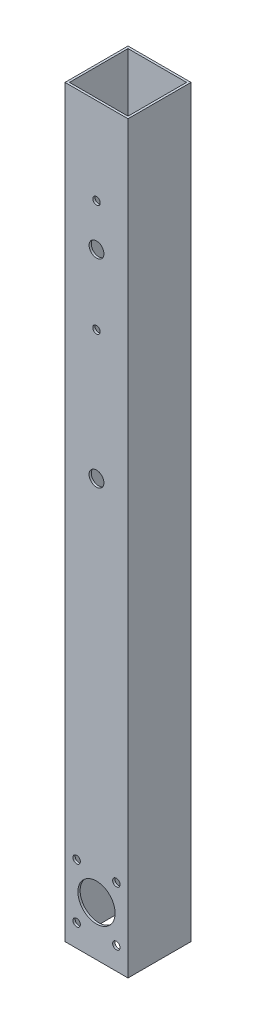
ISO-10303-21;
HEADER;
FILE_DESCRIPTION(('STEP AP214'),'2;1');
FILE_NAME('part.step','',(''),(''),'','','');
FILE_SCHEMA(('AUTOMOTIVE_DESIGN { 1 0 10303 214 1 1 1 1 }'));
ENDSEC;
DATA;
#1=APPLICATION_CONTEXT('core data for automotive mechanical design processes');
#2=APPLICATION_PROTOCOL_DEFINITION('international standard','automotive_design',2000,#1);
#3=PRODUCT_CONTEXT('',#1,'mechanical');
#4=PRODUCT('Part','Part','',(#3));
#5=PRODUCT_RELATED_PRODUCT_CATEGORY('part','',(#4));
#6=PRODUCT_DEFINITION_FORMATION('','',#4);
#7=PRODUCT_DEFINITION_CONTEXT('part definition',#1,'design');
#8=PRODUCT_DEFINITION('design','',#6,#7);
#9=PRODUCT_DEFINITION_SHAPE('','',#8);
#10=(LENGTH_UNIT() NAMED_UNIT(*) SI_UNIT(.MILLI.,.METRE.));
#11=(NAMED_UNIT(*) PLANE_ANGLE_UNIT() SI_UNIT($,.RADIAN.));
#12=(NAMED_UNIT(*) SI_UNIT($,.STERADIAN.) SOLID_ANGLE_UNIT());
#13=UNCERTAINTY_MEASURE_WITH_UNIT(LENGTH_MEASURE(1.E-05),#10,'distance_accuracy_value','');
#14=(GEOMETRIC_REPRESENTATION_CONTEXT(3) GLOBAL_UNCERTAINTY_ASSIGNED_CONTEXT((#13)) GLOBAL_UNIT_ASSIGNED_CONTEXT((#10,
#11,#12)) REPRESENTATION_CONTEXT('',''));
#15=CARTESIAN_POINT('',(0.,0.,0.));
#16=DIRECTION('',(0.,0.,1.));
#17=DIRECTION('',(1.,0.,0.));
#18=AXIS2_PLACEMENT_3D('',#15,#16,#17);
#19=CARTESIAN_POINT('',(0.,300.,0.));
#20=DIRECTION('',(0.,1.,0.));
#21=DIRECTION('',(0.,0.,1.));
#22=AXIS2_PLACEMENT_3D('',#19,#20,#21);
#23=PLANE('',#22);
#24=DIRECTION('',(0.,0.,-1.));
#25=VECTOR('',#24,1.);
#26=CARTESIAN_POINT('',(12.7,300.,-12.7));
#27=LINE('',#26,#25);
#28=CARTESIAN_POINT('',(12.7,300.,12.7));
#29=VERTEX_POINT('',#28);
#30=CARTESIAN_POINT('',(12.7,300.,-12.7));
#31=VERTEX_POINT('',#30);
#32=EDGE_CURVE('E160',#29,#31,#27,.T.);
#33=ORIENTED_EDGE('',*,*,#32,.T.);
#34=DIRECTION('',(-1.,0.,0.));
#35=VECTOR('',#34,1.);
#36=CARTESIAN_POINT('',(-12.7,300.,-12.7));
#37=LINE('',#36,#35);
#38=CARTESIAN_POINT('',(-12.7,300.,-12.7));
#39=VERTEX_POINT('',#38);
#40=EDGE_CURVE('E164',#31,#39,#37,.T.);
#41=ORIENTED_EDGE('',*,*,#40,.T.);
#42=DIRECTION('',(0.,0.,1.));
#43=VECTOR('',#42,1.);
#44=CARTESIAN_POINT('',(-12.7,300.,-12.7));
#45=LINE('',#44,#43);
#46=CARTESIAN_POINT('',(-12.7,300.,12.7));
#47=VERTEX_POINT('',#46);
#48=EDGE_CURVE('E168',#39,#47,#45,.T.);
#49=ORIENTED_EDGE('',*,*,#48,.T.);
#50=DIRECTION('',(1.,0.,0.));
#51=VECTOR('',#50,1.);
#52=CARTESIAN_POINT('',(-12.7,300.,12.7));
#53=LINE('',#52,#51);
#54=EDGE_CURVE('E171',#47,#29,#53,.T.);
#55=ORIENTED_EDGE('',*,*,#54,.T.);
#56=EDGE_LOOP('',(#33,#41,#49,#55));
#57=FACE_BOUND('',#56,.T.);
#58=DIRECTION('',(0.,0.,1.));
#59=VECTOR('',#58,1.);
#60=CARTESIAN_POINT('',(-11.8,300.,-11.8));
#61=LINE('',#60,#59);
#62=CARTESIAN_POINT('',(-11.8,300.,-11.8));
#63=VERTEX_POINT('',#62);
#64=CARTESIAN_POINT('',(-11.8,300.,11.8));
#65=VERTEX_POINT('',#64);
#66=EDGE_CURVE('E119',#63,#65,#61,.T.);
#67=ORIENTED_EDGE('',*,*,#66,.F.);
#68=DIRECTION('',(-1.,0.,0.));
#69=VECTOR('',#68,1.);
#70=CARTESIAN_POINT('',(-11.8,300.,-11.8));
#71=LINE('',#70,#69);
#72=CARTESIAN_POINT('',(11.8,300.,-11.8));
#73=VERTEX_POINT('',#72);
#74=EDGE_CURVE('E110',#73,#63,#71,.T.);
#75=ORIENTED_EDGE('',*,*,#74,.F.);
#76=DIRECTION('',(0.,0.,-1.));
#77=VECTOR('',#76,1.);
#78=CARTESIAN_POINT('',(11.8,300.,-11.8));
#79=LINE('',#78,#77);
#80=CARTESIAN_POINT('',(11.8,300.,11.8));
#81=VERTEX_POINT('',#80);
#82=EDGE_CURVE('E136',#81,#73,#79,.T.);
#83=ORIENTED_EDGE('',*,*,#82,.F.);
#84=DIRECTION('',(1.,0.,0.));
#85=VECTOR('',#84,1.);
#86=CARTESIAN_POINT('',(-11.8,300.,11.8));
#87=LINE('',#86,#85);
#88=EDGE_CURVE('E132',#65,#81,#87,.T.);
#89=ORIENTED_EDGE('',*,*,#88,.F.);
#90=EDGE_LOOP('',(#67,#75,#83,#89));
#91=FACE_BOUND('',#90,.T.);
#92=ADVANCED_FACE('F42',(#57,#91),#23,.T.);
#93=CARTESIAN_POINT('',(0.,0.,0.));
#94=DIRECTION('',(0.,1.,0.));
#95=DIRECTION('',(0.,0.,1.));
#96=AXIS2_PLACEMENT_3D('',#93,#94,#95);
#97=PLANE('',#96);
#98=DIRECTION('',(0.,0.,-1.));
#99=VECTOR('',#98,1.);
#100=CARTESIAN_POINT('',(12.7,0.,-12.7));
#101=LINE('',#100,#99);
#102=CARTESIAN_POINT('',(12.7,0.,12.7));
#103=VERTEX_POINT('',#102);
#104=CARTESIAN_POINT('',(12.7,0.,-12.7));
#105=VERTEX_POINT('',#104);
#106=EDGE_CURVE('E128',#103,#105,#101,.T.);
#107=ORIENTED_EDGE('',*,*,#106,.F.);
#108=DIRECTION('',(1.,0.,0.));
#109=VECTOR('',#108,1.);
#110=CARTESIAN_POINT('',(-12.7,0.,12.7));
#111=LINE('',#110,#109);
#112=CARTESIAN_POINT('',(-12.7,0.,12.7));
#113=VERTEX_POINT('',#112);
#114=EDGE_CURVE('E165',#113,#103,#111,.T.);
#115=ORIENTED_EDGE('',*,*,#114,.F.);
#116=DIRECTION('',(0.,0.,1.));
#117=VECTOR('',#116,1.);
#118=CARTESIAN_POINT('',(-12.7,0.,-12.7));
#119=LINE('',#118,#117);
#120=CARTESIAN_POINT('',(-12.7,0.,-12.7));
#121=VERTEX_POINT('',#120);
#122=EDGE_CURVE('E181',#121,#113,#119,.T.);
#123=ORIENTED_EDGE('',*,*,#122,.F.);
#124=DIRECTION('',(-1.,0.,0.));
#125=VECTOR('',#124,1.);
#126=CARTESIAN_POINT('',(-12.7,0.,-12.7));
#127=LINE('',#126,#125);
#128=EDGE_CURVE('E178',#105,#121,#127,.T.);
#129=ORIENTED_EDGE('',*,*,#128,.F.);
#130=EDGE_LOOP('',(#107,#115,#123,#129));
#131=FACE_BOUND('',#130,.T.);
#132=DIRECTION('',(-1.,0.,0.));
#133=VECTOR('',#132,1.);
#134=CARTESIAN_POINT('',(-11.8,0.,-11.8));
#135=LINE('',#134,#133);
#136=CARTESIAN_POINT('',(11.8,0.,-11.8));
#137=VERTEX_POINT('',#136);
#138=CARTESIAN_POINT('',(-11.8,0.,-11.8));
#139=VERTEX_POINT('',#138);
#140=EDGE_CURVE('E68',#137,#139,#135,.T.);
#141=ORIENTED_EDGE('',*,*,#140,.T.);
#142=DIRECTION('',(0.,0.,1.));
#143=VECTOR('',#142,1.);
#144=CARTESIAN_POINT('',(-11.8,0.,-11.8));
#145=LINE('',#144,#143);
#146=CARTESIAN_POINT('',(-11.8,0.,11.8));
#147=VERTEX_POINT('',#146);
#148=EDGE_CURVE('E126',#139,#147,#145,.T.);
#149=ORIENTED_EDGE('',*,*,#148,.T.);
#150=DIRECTION('',(1.,0.,0.));
#151=VECTOR('',#150,1.);
#152=CARTESIAN_POINT('',(-11.8,0.,11.8));
#153=LINE('',#152,#151);
#154=CARTESIAN_POINT('',(11.8,0.,11.8));
#155=VERTEX_POINT('',#154);
#156=EDGE_CURVE('E147',#147,#155,#153,.T.);
#157=ORIENTED_EDGE('',*,*,#156,.T.);
#158=DIRECTION('',(0.,0.,-1.));
#159=VECTOR('',#158,1.);
#160=CARTESIAN_POINT('',(11.8,0.,-11.8));
#161=LINE('',#160,#159);
#162=EDGE_CURVE('E120',#155,#137,#161,.T.);
#163=ORIENTED_EDGE('',*,*,#162,.T.);
#164=EDGE_LOOP('',(#141,#149,#157,#163));
#165=FACE_BOUND('',#164,.T.);
#166=ADVANCED_FACE('F358',(#131,#165),#97,.F.);
#167=CARTESIAN_POINT('',(12.7,300.,-12.7));
#168=DIRECTION('',(-1.,0.,0.));
#169=DIRECTION('',(0.,0.,1.));
#170=AXIS2_PLACEMENT_3D('',#167,#168,#169);
#171=PLANE('',#170);
#172=ORIENTED_EDGE('',*,*,#106,.T.);
#173=DIRECTION('',(0.,-1.,0.));
#174=VECTOR('',#173,1.);
#175=CARTESIAN_POINT('',(12.7,300.,-12.7));
#176=LINE('',#175,#174);
#177=EDGE_CURVE('E11',#31,#105,#176,.T.);
#178=ORIENTED_EDGE('',*,*,#177,.F.);
#179=ORIENTED_EDGE('',*,*,#32,.F.);
#180=DIRECTION('',(0.,-1.,0.));
#181=VECTOR('',#180,1.);
#182=CARTESIAN_POINT('',(12.7,300.,12.7));
#183=LINE('',#182,#181);
#184=EDGE_CURVE('E174',#29,#103,#183,.T.);
#185=ORIENTED_EDGE('',*,*,#184,.T.);
#186=EDGE_LOOP('',(#172,#178,#179,#185));
#187=FACE_BOUND('',#186,.T.);
#188=ADVANCED_FACE('F44',(#187),#171,.F.);
#189=CARTESIAN_POINT('',(-12.7,300.,-12.7));
#190=DIRECTION('',(0.,0.,1.));
#191=DIRECTION('',(1.,0.,0.));
#192=AXIS2_PLACEMENT_3D('',#189,#190,#191);
#193=PLANE('',#192);
#194=CARTESIAN_POINT('',(0.,220.,-12.7));
#195=DIRECTION('',(0.,0.,-1.));
#196=DIRECTION('',(-1.,0.,0.));
#197=AXIS2_PLACEMENT_3D('',#194,#195,#196);
#198=CIRCLE('',#197,1.5);
#199=CARTESIAN_POINT('',(-1.50000000000001,220.,-12.7));
#200=VERTEX_POINT('',#199);
#201=EDGE_CURVE('E244',#200,#200,#198,.T.);
#202=ORIENTED_EDGE('',*,*,#201,.F.);
#203=EDGE_LOOP('',(#202));
#204=FACE_BOUND('',#203,.T.);
#205=CARTESIAN_POINT('',(0.,265.,-12.7));
#206=DIRECTION('',(0.,0.,-1.));
#207=DIRECTION('',(-1.,0.,0.));
#208=AXIS2_PLACEMENT_3D('',#205,#206,#207);
#209=CIRCLE('',#208,1.5);
#210=CARTESIAN_POINT('',(-1.5,265.,-12.7));
#211=VERTEX_POINT('',#210);
#212=EDGE_CURVE('E250',#211,#211,#209,.T.);
#213=ORIENTED_EDGE('',*,*,#212,.F.);
#214=EDGE_LOOP('',(#213));
#215=FACE_BOUND('',#214,.T.);
#216=CARTESIAN_POINT('',(7.99999999999999,31.,-12.7));
#217=DIRECTION('',(0.,0.,-1.));
#218=DIRECTION('',(-1.,0.,0.));
#219=AXIS2_PLACEMENT_3D('',#216,#217,#218);
#220=CIRCLE('',#219,1.5);
#221=CARTESIAN_POINT('',(6.49999999999999,31.,-12.7));
#222=VERTEX_POINT('',#221);
#223=EDGE_CURVE('E282',#222,#222,#220,.T.);
#224=ORIENTED_EDGE('',*,*,#223,.F.);
#225=EDGE_LOOP('',(#224));
#226=FACE_BOUND('',#225,.T.);
#227=CARTESIAN_POINT('',(8.,9.,-12.7));
#228=DIRECTION('',(0.,0.,-1.));
#229=DIRECTION('',(1.,0.,0.));
#230=AXIS2_PLACEMENT_3D('',#227,#228,#229);
#231=CIRCLE('',#230,1.5);
#232=CARTESIAN_POINT('',(9.5,9.,-12.7));
#233=VERTEX_POINT('',#232);
#234=EDGE_CURVE('E274',#233,#233,#231,.T.);
#235=ORIENTED_EDGE('',*,*,#234,.F.);
#236=EDGE_LOOP('',(#235));
#237=FACE_BOUND('',#236,.T.);
#238=CARTESIAN_POINT('',(-8.,9.,-12.7));
#239=DIRECTION('',(0.,0.,-1.));
#240=DIRECTION('',(-1.,0.,0.));
#241=AXIS2_PLACEMENT_3D('',#238,#239,#240);
#242=CIRCLE('',#241,1.5);
#243=CARTESIAN_POINT('',(-9.5,9.,-12.7));
#244=VERTEX_POINT('',#243);
#245=EDGE_CURVE('E265',#244,#244,#242,.T.);
#246=ORIENTED_EDGE('',*,*,#245,.F.);
#247=EDGE_LOOP('',(#246));
#248=FACE_BOUND('',#247,.T.);
#249=CARTESIAN_POINT('',(-7.99999999999999,31.,-12.7));
#250=DIRECTION('',(0.,0.,-1.));
#251=DIRECTION('',(1.,0.,0.));
#252=AXIS2_PLACEMENT_3D('',#249,#250,#251);
#253=CIRCLE('',#252,1.5);
#254=CARTESIAN_POINT('',(-6.49999999999999,31.,-12.7));
#255=VERTEX_POINT('',#254);
#256=EDGE_CURVE('E269',#255,#255,#253,.T.);
#257=ORIENTED_EDGE('',*,*,#256,.F.);
#258=EDGE_LOOP('',(#257));
#259=FACE_BOUND('',#258,.T.);
#260=CARTESIAN_POINT('',(0.,248.,-12.7));
#261=DIRECTION('',(0.,0.,-1.));
#262=DIRECTION('',(-1.,0.,0.));
#263=AXIS2_PLACEMENT_3D('',#260,#261,#262);
#264=CIRCLE('',#263,3.);
#265=CARTESIAN_POINT('',(-3.00000000000002,248.,-12.7));
#266=VERTEX_POINT('',#265);
#267=EDGE_CURVE('E311',#266,#266,#264,.T.);
#268=ORIENTED_EDGE('',*,*,#267,.F.);
#269=EDGE_LOOP('',(#268));
#270=FACE_BOUND('',#269,.T.);
#271=CARTESIAN_POINT('',(0.,168.,-12.7));
#272=DIRECTION('',(0.,0.,-1.));
#273=DIRECTION('',(-1.,0.,0.));
#274=AXIS2_PLACEMENT_3D('',#271,#272,#273);
#275=CIRCLE('',#274,3.);
#276=CARTESIAN_POINT('',(-3.00000000000002,168.,-12.7));
#277=VERTEX_POINT('',#276);
#278=EDGE_CURVE('E315',#277,#277,#275,.T.);
#279=ORIENTED_EDGE('',*,*,#278,.F.);
#280=EDGE_LOOP('',(#279));
#281=FACE_BOUND('',#280,.T.);
#282=CARTESIAN_POINT('',(0.,20.,-12.7));
#283=DIRECTION('',(0.,0.,-1.));
#284=DIRECTION('',(-1.,0.,0.));
#285=AXIS2_PLACEMENT_3D('',#282,#283,#284);
#286=CIRCLE('',#285,7.5);
#287=CARTESIAN_POINT('',(-7.5,20.,-12.7));
#288=VERTEX_POINT('',#287);
#289=EDGE_CURVE('E328',#288,#288,#286,.T.);
#290=ORIENTED_EDGE('',*,*,#289,.F.);
#291=EDGE_LOOP('',(#290));
#292=FACE_BOUND('',#291,.T.);
#293=ORIENTED_EDGE('',*,*,#128,.T.);
#294=DIRECTION('',(0.,-1.,0.));
#295=VECTOR('',#294,1.);
#296=CARTESIAN_POINT('',(-12.7,300.,-12.7));
#297=LINE('',#296,#295);
#298=EDGE_CURVE('E52',#39,#121,#297,.T.);
#299=ORIENTED_EDGE('',*,*,#298,.F.);
#300=ORIENTED_EDGE('',*,*,#40,.F.);
#301=ORIENTED_EDGE('',*,*,#177,.T.);
#302=EDGE_LOOP('',(#293,#299,#300,#301));
#303=FACE_BOUND('',#302,.T.);
#304=ADVANCED_FACE('F367',(#204,#215,#226,#237,#248,#259,#270,#281,#292,#303),#193,.F.);
#305=CARTESIAN_POINT('',(-12.7,300.,-12.7));
#306=DIRECTION('',(1.,0.,0.));
#307=DIRECTION('',(0.,0.,-1.));
#308=AXIS2_PLACEMENT_3D('',#305,#306,#307);
#309=PLANE('',#308);
#310=ORIENTED_EDGE('',*,*,#122,.T.);
#311=DIRECTION('',(0.,-1.,0.));
#312=VECTOR('',#311,1.);
#313=CARTESIAN_POINT('',(-12.7,300.,12.7));
#314=LINE('',#313,#312);
#315=EDGE_CURVE('E189',#47,#113,#314,.T.);
#316=ORIENTED_EDGE('',*,*,#315,.F.);
#317=ORIENTED_EDGE('',*,*,#48,.F.);
#318=ORIENTED_EDGE('',*,*,#298,.T.);
#319=EDGE_LOOP('',(#310,#316,#317,#318));
#320=FACE_BOUND('',#319,.T.);
#321=ADVANCED_FACE('F352',(#320),#309,.F.);
#322=CARTESIAN_POINT('',(-12.7,300.,12.7));
#323=DIRECTION('',(0.,0.,-1.));
#324=DIRECTION('',(-1.,0.,0.));
#325=AXIS2_PLACEMENT_3D('',#322,#323,#324);
#326=PLANE('',#325);
#327=CARTESIAN_POINT('',(0.,220.,12.7));
#328=DIRECTION('',(0.,0.,-1.));
#329=DIRECTION('',(-1.,0.,0.));
#330=AXIS2_PLACEMENT_3D('',#327,#328,#329);
#331=CIRCLE('',#330,1.5);
#332=CARTESIAN_POINT('',(-1.50000000000001,220.,12.7));
#333=VERTEX_POINT('',#332);
#334=EDGE_CURVE('E236',#333,#333,#331,.T.);
#335=ORIENTED_EDGE('',*,*,#334,.T.);
#336=EDGE_LOOP('',(#335));
#337=FACE_BOUND('',#336,.T.);
#338=CARTESIAN_POINT('',(0.,265.,12.7));
#339=DIRECTION('',(0.,0.,-1.));
#340=DIRECTION('',(-1.,0.,0.));
#341=AXIS2_PLACEMENT_3D('',#338,#339,#340);
#342=CIRCLE('',#341,1.5);
#343=CARTESIAN_POINT('',(-1.5,265.,12.7));
#344=VERTEX_POINT('',#343);
#345=EDGE_CURVE('E256',#344,#344,#342,.T.);
#346=ORIENTED_EDGE('',*,*,#345,.T.);
#347=EDGE_LOOP('',(#346));
#348=FACE_BOUND('',#347,.T.);
#349=CARTESIAN_POINT('',(7.99999999999999,31.,12.7));
#350=DIRECTION('',(0.,0.,-1.));
#351=DIRECTION('',(-1.,0.,0.));
#352=AXIS2_PLACEMENT_3D('',#349,#350,#351);
#353=CIRCLE('',#352,1.5);
#354=CARTESIAN_POINT('',(6.49999999999999,31.,12.7));
#355=VERTEX_POINT('',#354);
#356=EDGE_CURVE('E264',#355,#355,#353,.T.);
#357=ORIENTED_EDGE('',*,*,#356,.T.);
#358=EDGE_LOOP('',(#357));
#359=FACE_BOUND('',#358,.T.);
#360=CARTESIAN_POINT('',(8.,9.,12.7));
#361=DIRECTION('',(0.,0.,-1.));
#362=DIRECTION('',(1.,0.,0.));
#363=AXIS2_PLACEMENT_3D('',#360,#361,#362);
#364=CIRCLE('',#363,1.5);
#365=CARTESIAN_POINT('',(9.5,9.,12.7));
#366=VERTEX_POINT('',#365);
#367=EDGE_CURVE('E278',#366,#366,#364,.T.);
#368=ORIENTED_EDGE('',*,*,#367,.T.);
#369=EDGE_LOOP('',(#368));
#370=FACE_BOUND('',#369,.T.);
#371=CARTESIAN_POINT('',(-8.,9.,12.7));
#372=DIRECTION('',(0.,0.,-1.));
#373=DIRECTION('',(-1.,0.,0.));
#374=AXIS2_PLACEMENT_3D('',#371,#372,#373);
#375=CIRCLE('',#374,1.5);
#376=CARTESIAN_POINT('',(-9.5,9.,12.7));
#377=VERTEX_POINT('',#376);
#378=EDGE_CURVE('E270',#377,#377,#375,.T.);
#379=ORIENTED_EDGE('',*,*,#378,.T.);
#380=EDGE_LOOP('',(#379));
#381=FACE_BOUND('',#380,.T.);
#382=CARTESIAN_POINT('',(-7.99999999999999,31.,12.7));
#383=DIRECTION('',(0.,0.,-1.));
#384=DIRECTION('',(1.,0.,0.));
#385=AXIS2_PLACEMENT_3D('',#382,#383,#384);
#386=CIRCLE('',#385,1.5);
#387=CARTESIAN_POINT('',(-6.49999999999999,31.,12.7));
#388=VERTEX_POINT('',#387);
#389=EDGE_CURVE('E217',#388,#388,#386,.T.);
#390=ORIENTED_EDGE('',*,*,#389,.T.);
#391=EDGE_LOOP('',(#390));
#392=FACE_BOUND('',#391,.T.);
#393=CARTESIAN_POINT('',(0.,248.,12.7));
#394=DIRECTION('',(0.,0.,-1.));
#395=DIRECTION('',(-1.,0.,0.));
#396=AXIS2_PLACEMENT_3D('',#393,#394,#395);
#397=CIRCLE('',#396,3.);
#398=CARTESIAN_POINT('',(-3.00000000000002,248.,12.7));
#399=VERTEX_POINT('',#398);
#400=EDGE_CURVE('E206',#399,#399,#397,.T.);
#401=ORIENTED_EDGE('',*,*,#400,.T.);
#402=EDGE_LOOP('',(#401));
#403=FACE_BOUND('',#402,.T.);
#404=CARTESIAN_POINT('',(0.,168.,12.7));
#405=DIRECTION('',(0.,0.,-1.));
#406=DIRECTION('',(-1.,0.,0.));
#407=AXIS2_PLACEMENT_3D('',#404,#405,#406);
#408=CIRCLE('',#407,3.);
#409=CARTESIAN_POINT('',(-3.00000000000002,168.,12.7));
#410=VERTEX_POINT('',#409);
#411=EDGE_CURVE('E307',#410,#410,#408,.T.);
#412=ORIENTED_EDGE('',*,*,#411,.T.);
#413=EDGE_LOOP('',(#412));
#414=FACE_BOUND('',#413,.T.);
#415=CARTESIAN_POINT('',(0.,20.,12.7));
#416=DIRECTION('',(0.,0.,-1.));
#417=DIRECTION('',(-1.,0.,0.));
#418=AXIS2_PLACEMENT_3D('',#415,#416,#417);
#419=CIRCLE('',#418,7.5);
#420=CARTESIAN_POINT('',(-7.5,20.,12.7));
#421=VERTEX_POINT('',#420);
#422=EDGE_CURVE('E200',#421,#421,#419,.T.);
#423=ORIENTED_EDGE('',*,*,#422,.T.);
#424=EDGE_LOOP('',(#423));
#425=FACE_BOUND('',#424,.T.);
#426=ORIENTED_EDGE('',*,*,#114,.T.);
#427=ORIENTED_EDGE('',*,*,#184,.F.);
#428=ORIENTED_EDGE('',*,*,#54,.F.);
#429=ORIENTED_EDGE('',*,*,#315,.T.);
#430=EDGE_LOOP('',(#426,#427,#428,#429));
#431=FACE_BOUND('',#430,.T.);
#432=ADVANCED_FACE('F342',(#337,#348,#359,#370,#381,#392,#403,#414,#425,#431),#326,.F.);
#433=CARTESIAN_POINT('',(-11.8,300.,-11.8));
#434=DIRECTION('',(0.,0.,1.));
#435=DIRECTION('',(1.,0.,0.));
#436=AXIS2_PLACEMENT_3D('',#433,#434,#435);
#437=PLANE('',#436);
#438=CARTESIAN_POINT('',(0.,220.,-11.8));
#439=DIRECTION('',(0.,0.,1.));
#440=DIRECTION('',(1.,0.,0.));
#441=AXIS2_PLACEMENT_3D('',#438,#439,#440);
#442=CIRCLE('',#441,1.5);
#443=CARTESIAN_POINT('',(1.49999999999999,220.,-11.8));
#444=VERTEX_POINT('',#443);
#445=EDGE_CURVE('E260',#444,#444,#442,.T.);
#446=ORIENTED_EDGE('',*,*,#445,.F.);
#447=EDGE_LOOP('',(#446));
#448=FACE_BOUND('',#447,.T.);
#449=CARTESIAN_POINT('',(0.,265.,-11.8));
#450=DIRECTION('',(0.,0.,1.));
#451=DIRECTION('',(1.,0.,0.));
#452=AXIS2_PLACEMENT_3D('',#449,#450,#451);
#453=CIRCLE('',#452,1.5);
#454=CARTESIAN_POINT('',(1.5,265.,-11.8));
#455=VERTEX_POINT('',#454);
#456=EDGE_CURVE('E235',#455,#455,#453,.T.);
#457=ORIENTED_EDGE('',*,*,#456,.F.);
#458=EDGE_LOOP('',(#457));
#459=FACE_BOUND('',#458,.T.);
#460=CARTESIAN_POINT('',(7.99999999999999,31.,-11.8));
#461=DIRECTION('',(0.,0.,1.));
#462=DIRECTION('',(1.,0.,0.));
#463=AXIS2_PLACEMENT_3D('',#460,#461,#462);
#464=CIRCLE('',#463,1.5);
#465=CARTESIAN_POINT('',(9.49999999999999,31.,-11.8));
#466=VERTEX_POINT('',#465);
#467=EDGE_CURVE('E231',#466,#466,#464,.T.);
#468=ORIENTED_EDGE('',*,*,#467,.F.);
#469=EDGE_LOOP('',(#468));
#470=FACE_BOUND('',#469,.T.);
#471=CARTESIAN_POINT('',(8.,9.,-11.8));
#472=DIRECTION('',(0.,0.,1.));
#473=DIRECTION('',(1.,0.,0.));
#474=AXIS2_PLACEMENT_3D('',#471,#472,#473);
#475=CIRCLE('',#474,1.5);
#476=CARTESIAN_POINT('',(9.5,9.,-11.8));
#477=VERTEX_POINT('',#476);
#478=EDGE_CURVE('E227',#477,#477,#475,.T.);
#479=ORIENTED_EDGE('',*,*,#478,.F.);
#480=EDGE_LOOP('',(#479));
#481=FACE_BOUND('',#480,.T.);
#482=CARTESIAN_POINT('',(-8.,9.,-11.8));
#483=DIRECTION('',(0.,0.,1.));
#484=DIRECTION('',(1.,0.,0.));
#485=AXIS2_PLACEMENT_3D('',#482,#483,#484);
#486=CIRCLE('',#485,1.5);
#487=CARTESIAN_POINT('',(-6.5,9.,-11.8));
#488=VERTEX_POINT('',#487);
#489=EDGE_CURVE('E222',#488,#488,#486,.T.);
#490=ORIENTED_EDGE('',*,*,#489,.F.);
#491=EDGE_LOOP('',(#490));
#492=FACE_BOUND('',#491,.T.);
#493=CARTESIAN_POINT('',(-7.99999999999999,31.,-11.8));
#494=DIRECTION('',(0.,0.,1.));
#495=DIRECTION('',(1.,0.,0.));
#496=AXIS2_PLACEMENT_3D('',#493,#494,#495);
#497=CIRCLE('',#496,1.5);
#498=CARTESIAN_POINT('',(-6.49999999999999,31.,-11.8));
#499=VERTEX_POINT('',#498);
#500=EDGE_CURVE('E216',#499,#499,#497,.T.);
#501=ORIENTED_EDGE('',*,*,#500,.F.);
#502=EDGE_LOOP('',(#501));
#503=FACE_BOUND('',#502,.T.);
#504=CARTESIAN_POINT('',(0.,248.,-11.8));
#505=DIRECTION('',(0.,0.,1.));
#506=DIRECTION('',(1.,0.,0.));
#507=AXIS2_PLACEMENT_3D('',#504,#505,#506);
#508=CIRCLE('',#507,3.);
#509=CARTESIAN_POINT('',(2.99999999999999,248.,-11.8));
#510=VERTEX_POINT('',#509);
#511=EDGE_CURVE('E211',#510,#510,#508,.T.);
#512=ORIENTED_EDGE('',*,*,#511,.F.);
#513=EDGE_LOOP('',(#512));
#514=FACE_BOUND('',#513,.T.);
#515=CARTESIAN_POINT('',(0.,168.,-11.8));
#516=DIRECTION('',(0.,0.,1.));
#517=DIRECTION('',(1.,0.,0.));
#518=AXIS2_PLACEMENT_3D('',#515,#516,#517);
#519=CIRCLE('',#518,3.);
#520=CARTESIAN_POINT('',(2.99999999999999,168.,-11.8));
#521=VERTEX_POINT('',#520);
#522=EDGE_CURVE('E205',#521,#521,#519,.T.);
#523=ORIENTED_EDGE('',*,*,#522,.F.);
#524=EDGE_LOOP('',(#523));
#525=FACE_BOUND('',#524,.T.);
#526=CARTESIAN_POINT('',(0.,20.,-11.8));
#527=DIRECTION('',(0.,0.,1.));
#528=DIRECTION('',(1.,0.,0.));
#529=AXIS2_PLACEMENT_3D('',#526,#527,#528);
#530=CIRCLE('',#529,7.5);
#531=CARTESIAN_POINT('',(7.5,20.,-11.8));
#532=VERTEX_POINT('',#531);
#533=EDGE_CURVE('E144',#532,#532,#530,.T.);
#534=ORIENTED_EDGE('',*,*,#533,.F.);
#535=EDGE_LOOP('',(#534));
#536=FACE_BOUND('',#535,.T.);
#537=ORIENTED_EDGE('',*,*,#140,.F.);
#538=DIRECTION('',(0.,-1.,0.));
#539=VECTOR('',#538,1.);
#540=CARTESIAN_POINT('',(11.8,300.,-11.8));
#541=LINE('',#540,#539);
#542=EDGE_CURVE('E114',#73,#137,#541,.T.);
#543=ORIENTED_EDGE('',*,*,#542,.F.);
#544=ORIENTED_EDGE('',*,*,#74,.T.);
#545=DIRECTION('',(0.,-1.,0.));
#546=VECTOR('',#545,1.);
#547=CARTESIAN_POINT('',(-11.8,300.,-11.8));
#548=LINE('',#547,#546);
#549=EDGE_CURVE('E113',#63,#139,#548,.T.);
#550=ORIENTED_EDGE('',*,*,#549,.T.);
#551=EDGE_LOOP('',(#537,#543,#544,#550));
#552=FACE_BOUND('',#551,.T.);
#553=ADVANCED_FACE('F112',(#448,#459,#470,#481,#492,#503,#514,#525,#536,#552),#437,.T.);
#554=CARTESIAN_POINT('',(-11.8,300.,-11.8));
#555=DIRECTION('',(1.,0.,0.));
#556=DIRECTION('',(0.,0.,-1.));
#557=AXIS2_PLACEMENT_3D('',#554,#555,#556);
#558=PLANE('',#557);
#559=ORIENTED_EDGE('',*,*,#148,.F.);
#560=ORIENTED_EDGE('',*,*,#549,.F.);
#561=ORIENTED_EDGE('',*,*,#66,.T.);
#562=DIRECTION('',(0.,-1.,0.));
#563=VECTOR('',#562,1.);
#564=CARTESIAN_POINT('',(-11.8,300.,11.8));
#565=LINE('',#564,#563);
#566=EDGE_CURVE('E129',#65,#147,#565,.T.);
#567=ORIENTED_EDGE('',*,*,#566,.T.);
#568=EDGE_LOOP('',(#559,#560,#561,#567));
#569=FACE_BOUND('',#568,.T.);
#570=ADVANCED_FACE('F123',(#569),#558,.T.);
#571=CARTESIAN_POINT('',(-11.8,300.,11.8));
#572=DIRECTION('',(0.,0.,-1.));
#573=DIRECTION('',(-1.,0.,0.));
#574=AXIS2_PLACEMENT_3D('',#571,#572,#573);
#575=PLANE('',#574);
#576=CARTESIAN_POINT('',(0.,220.,11.8));
#577=DIRECTION('',(0.,0.,-1.));
#578=DIRECTION('',(-1.,0.,0.));
#579=AXIS2_PLACEMENT_3D('',#576,#577,#578);
#580=CIRCLE('',#579,1.5);
#581=CARTESIAN_POINT('',(-1.50000000000001,220.,11.8));
#582=VERTEX_POINT('',#581);
#583=EDGE_CURVE('E46',#582,#582,#580,.T.);
#584=ORIENTED_EDGE('',*,*,#583,.F.);
#585=EDGE_LOOP('',(#584));
#586=FACE_BOUND('',#585,.T.);
#587=CARTESIAN_POINT('',(0.,265.,11.8));
#588=DIRECTION('',(0.,0.,-1.));
#589=DIRECTION('',(-1.,0.,0.));
#590=AXIS2_PLACEMENT_3D('',#587,#588,#589);
#591=CIRCLE('',#590,1.5);
#592=CARTESIAN_POINT('',(-1.5,265.,11.8));
#593=VERTEX_POINT('',#592);
#594=EDGE_CURVE('E232',#593,#593,#591,.T.);
#595=ORIENTED_EDGE('',*,*,#594,.F.);
#596=EDGE_LOOP('',(#595));
#597=FACE_BOUND('',#596,.T.);
#598=CARTESIAN_POINT('',(7.99999999999999,31.,11.8));
#599=DIRECTION('',(0.,0.,-1.));
#600=DIRECTION('',(-1.,0.,0.));
#601=AXIS2_PLACEMENT_3D('',#598,#599,#600);
#602=CIRCLE('',#601,1.5);
#603=CARTESIAN_POINT('',(6.49999999999999,31.,11.8));
#604=VERTEX_POINT('',#603);
#605=EDGE_CURVE('E228',#604,#604,#602,.T.);
#606=ORIENTED_EDGE('',*,*,#605,.F.);
#607=EDGE_LOOP('',(#606));
#608=FACE_BOUND('',#607,.T.);
#609=CARTESIAN_POINT('',(8.,9.,11.8));
#610=DIRECTION('',(0.,0.,-1.));
#611=DIRECTION('',(-1.,0.,0.));
#612=AXIS2_PLACEMENT_3D('',#609,#610,#611);
#613=CIRCLE('',#612,1.5);
#614=CARTESIAN_POINT('',(6.5,9.,11.8));
#615=VERTEX_POINT('',#614);
#616=EDGE_CURVE('E223',#615,#615,#613,.T.);
#617=ORIENTED_EDGE('',*,*,#616,.F.);
#618=EDGE_LOOP('',(#617));
#619=FACE_BOUND('',#618,.T.);
#620=CARTESIAN_POINT('',(-8.,9.,11.8));
#621=DIRECTION('',(0.,0.,-1.));
#622=DIRECTION('',(-1.,0.,0.));
#623=AXIS2_PLACEMENT_3D('',#620,#621,#622);
#624=CIRCLE('',#623,1.5);
#625=CARTESIAN_POINT('',(-9.5,9.,11.8));
#626=VERTEX_POINT('',#625);
#627=EDGE_CURVE('E218',#626,#626,#624,.T.);
#628=ORIENTED_EDGE('',*,*,#627,.F.);
#629=EDGE_LOOP('',(#628));
#630=FACE_BOUND('',#629,.T.);
#631=CARTESIAN_POINT('',(-7.99999999999999,31.,11.8));
#632=DIRECTION('',(0.,0.,-1.));
#633=DIRECTION('',(-1.,0.,0.));
#634=AXIS2_PLACEMENT_3D('',#631,#632,#633);
#635=CIRCLE('',#634,1.5);
#636=CARTESIAN_POINT('',(-9.49999999999999,31.,11.8));
#637=VERTEX_POINT('',#636);
#638=EDGE_CURVE('E212',#637,#637,#635,.T.);
#639=ORIENTED_EDGE('',*,*,#638,.F.);
#640=EDGE_LOOP('',(#639));
#641=FACE_BOUND('',#640,.T.);
#642=CARTESIAN_POINT('',(0.,248.,11.8));
#643=DIRECTION('',(0.,0.,-1.));
#644=DIRECTION('',(-1.,0.,0.));
#645=AXIS2_PLACEMENT_3D('',#642,#643,#644);
#646=CIRCLE('',#645,3.);
#647=CARTESIAN_POINT('',(-3.00000000000002,248.,11.8));
#648=VERTEX_POINT('',#647);
#649=EDGE_CURVE('E207',#648,#648,#646,.T.);
#650=ORIENTED_EDGE('',*,*,#649,.F.);
#651=EDGE_LOOP('',(#650));
#652=FACE_BOUND('',#651,.T.);
#653=CARTESIAN_POINT('',(0.,168.,11.8));
#654=DIRECTION('',(0.,0.,-1.));
#655=DIRECTION('',(-1.,0.,0.));
#656=AXIS2_PLACEMENT_3D('',#653,#654,#655);
#657=CIRCLE('',#656,3.);
#658=CARTESIAN_POINT('',(-3.00000000000002,168.,11.8));
#659=VERTEX_POINT('',#658);
#660=EDGE_CURVE('E201',#659,#659,#657,.T.);
#661=ORIENTED_EDGE('',*,*,#660,.F.);
#662=EDGE_LOOP('',(#661));
#663=FACE_BOUND('',#662,.T.);
#664=CARTESIAN_POINT('',(0.,20.,11.8));
#665=DIRECTION('',(0.,0.,-1.));
#666=DIRECTION('',(-1.,0.,0.));
#667=AXIS2_PLACEMENT_3D('',#664,#665,#666);
#668=CIRCLE('',#667,7.5);
#669=CARTESIAN_POINT('',(-7.5,20.,11.8));
#670=VERTEX_POINT('',#669);
#671=EDGE_CURVE('E196',#670,#670,#668,.T.);
#672=ORIENTED_EDGE('',*,*,#671,.F.);
#673=EDGE_LOOP('',(#672));
#674=FACE_BOUND('',#673,.T.);
#675=ORIENTED_EDGE('',*,*,#156,.F.);
#676=ORIENTED_EDGE('',*,*,#566,.F.);
#677=ORIENTED_EDGE('',*,*,#88,.T.);
#678=DIRECTION('',(0.,-1.,0.));
#679=VECTOR('',#678,1.);
#680=CARTESIAN_POINT('',(11.8,300.,11.8));
#681=LINE('',#680,#679);
#682=EDGE_CURVE('E60',#81,#155,#681,.T.);
#683=ORIENTED_EDGE('',*,*,#682,.T.);
#684=EDGE_LOOP('',(#675,#676,#677,#683));
#685=FACE_BOUND('',#684,.T.);
#686=ADVANCED_FACE('F350',(#586,#597,#608,#619,#630,#641,#652,#663,#674,#685),#575,.T.);
#687=CARTESIAN_POINT('',(11.8,300.,-11.8));
#688=DIRECTION('',(-1.,0.,0.));
#689=DIRECTION('',(0.,0.,1.));
#690=AXIS2_PLACEMENT_3D('',#687,#688,#689);
#691=PLANE('',#690);
#692=ORIENTED_EDGE('',*,*,#162,.F.);
#693=ORIENTED_EDGE('',*,*,#682,.F.);
#694=ORIENTED_EDGE('',*,*,#82,.T.);
#695=ORIENTED_EDGE('',*,*,#542,.T.);
#696=EDGE_LOOP('',(#692,#693,#694,#695));
#697=FACE_BOUND('',#696,.T.);
#698=ADVANCED_FACE('F407',(#697),#691,.T.);
#699=CARTESIAN_POINT('',(0.,20.,12.7));
#700=DIRECTION('',(0.,0.,-1.));
#701=DIRECTION('',(-1.,0.,0.));
#702=AXIS2_PLACEMENT_3D('',#699,#700,#701);
#703=CYLINDRICAL_SURFACE('',#702,7.5);
#704=ORIENTED_EDGE('',*,*,#671,.T.);
#705=EDGE_LOOP('',(#704));
#706=FACE_BOUND('',#705,.T.);
#707=ORIENTED_EDGE('',*,*,#422,.F.);
#708=EDGE_LOOP('',(#707));
#709=FACE_BOUND('',#708,.T.);
#710=ADVANCED_FACE('F409',(#706,#709),#703,.F.);
#711=ORIENTED_EDGE('',*,*,#533,.T.);
#712=EDGE_LOOP('',(#711));
#713=FACE_BOUND('',#712,.T.);
#714=ORIENTED_EDGE('',*,*,#289,.T.);
#715=EDGE_LOOP('',(#714));
#716=FACE_BOUND('',#715,.T.);
#717=ADVANCED_FACE('F338',(#713,#716),#703,.F.);
#718=CARTESIAN_POINT('',(0.,168.,12.7));
#719=DIRECTION('',(0.,0.,-1.));
#720=DIRECTION('',(-1.,0.,0.));
#721=AXIS2_PLACEMENT_3D('',#718,#719,#720);
#722=CYLINDRICAL_SURFACE('',#721,3.);
#723=ORIENTED_EDGE('',*,*,#660,.T.);
#724=EDGE_LOOP('',(#723));
#725=FACE_BOUND('',#724,.T.);
#726=ORIENTED_EDGE('',*,*,#411,.F.);
#727=EDGE_LOOP('',(#726));
#728=FACE_BOUND('',#727,.T.);
#729=ADVANCED_FACE('F420',(#725,#728),#722,.F.);
#730=CARTESIAN_POINT('',(0.,248.,12.7));
#731=DIRECTION('',(0.,0.,-1.));
#732=DIRECTION('',(-1.,0.,0.));
#733=AXIS2_PLACEMENT_3D('',#730,#731,#732);
#734=CYLINDRICAL_SURFACE('',#733,3.);
#735=ORIENTED_EDGE('',*,*,#649,.T.);
#736=EDGE_LOOP('',(#735));
#737=FACE_BOUND('',#736,.T.);
#738=ORIENTED_EDGE('',*,*,#400,.F.);
#739=EDGE_LOOP('',(#738));
#740=FACE_BOUND('',#739,.T.);
#741=ADVANCED_FACE('F423',(#737,#740),#734,.F.);
#742=ORIENTED_EDGE('',*,*,#522,.T.);
#743=EDGE_LOOP('',(#742));
#744=FACE_BOUND('',#743,.T.);
#745=ORIENTED_EDGE('',*,*,#278,.T.);
#746=EDGE_LOOP('',(#745));
#747=FACE_BOUND('',#746,.T.);
#748=ADVANCED_FACE('F425',(#744,#747),#722,.F.);
#749=ORIENTED_EDGE('',*,*,#511,.T.);
#750=EDGE_LOOP('',(#749));
#751=FACE_BOUND('',#750,.T.);
#752=ORIENTED_EDGE('',*,*,#267,.T.);
#753=EDGE_LOOP('',(#752));
#754=FACE_BOUND('',#753,.T.);
#755=ADVANCED_FACE('F429',(#751,#754),#734,.F.);
#756=CARTESIAN_POINT('',(-7.99999999999999,31.,12.7));
#757=DIRECTION('',(0.,0.,-1.));
#758=DIRECTION('',(-1.,0.,0.));
#759=AXIS2_PLACEMENT_3D('',#756,#757,#758);
#760=CYLINDRICAL_SURFACE('',#759,1.5);
#761=ORIENTED_EDGE('',*,*,#638,.T.);
#762=EDGE_LOOP('',(#761));
#763=FACE_BOUND('',#762,.T.);
#764=ORIENTED_EDGE('',*,*,#389,.F.);
#765=EDGE_LOOP('',(#764));
#766=FACE_BOUND('',#765,.T.);
#767=ADVANCED_FACE('F430',(#763,#766),#760,.F.);
#768=CARTESIAN_POINT('',(-8.,9.,12.7));
#769=DIRECTION('',(0.,0.,-1.));
#770=DIRECTION('',(-1.,0.,0.));
#771=AXIS2_PLACEMENT_3D('',#768,#769,#770);
#772=CYLINDRICAL_SURFACE('',#771,1.5);
#773=ORIENTED_EDGE('',*,*,#627,.T.);
#774=EDGE_LOOP('',(#773));
#775=FACE_BOUND('',#774,.T.);
#776=ORIENTED_EDGE('',*,*,#378,.F.);
#777=EDGE_LOOP('',(#776));
#778=FACE_BOUND('',#777,.T.);
#779=ADVANCED_FACE('F433',(#775,#778),#772,.F.);
#780=CARTESIAN_POINT('',(8.,9.,12.7));
#781=DIRECTION('',(0.,0.,-1.));
#782=DIRECTION('',(-1.,0.,0.));
#783=AXIS2_PLACEMENT_3D('',#780,#781,#782);
#784=CYLINDRICAL_SURFACE('',#783,1.5);
#785=ORIENTED_EDGE('',*,*,#616,.T.);
#786=EDGE_LOOP('',(#785));
#787=FACE_BOUND('',#786,.T.);
#788=ORIENTED_EDGE('',*,*,#367,.F.);
#789=EDGE_LOOP('',(#788));
#790=FACE_BOUND('',#789,.T.);
#791=ADVANCED_FACE('F439',(#787,#790),#784,.F.);
#792=CARTESIAN_POINT('',(7.99999999999999,31.,12.7));
#793=DIRECTION('',(0.,0.,-1.));
#794=DIRECTION('',(-1.,0.,0.));
#795=AXIS2_PLACEMENT_3D('',#792,#793,#794);
#796=CYLINDRICAL_SURFACE('',#795,1.5);
#797=ORIENTED_EDGE('',*,*,#605,.T.);
#798=EDGE_LOOP('',(#797));
#799=FACE_BOUND('',#798,.T.);
#800=ORIENTED_EDGE('',*,*,#356,.F.);
#801=EDGE_LOOP('',(#800));
#802=FACE_BOUND('',#801,.T.);
#803=ADVANCED_FACE('F436',(#799,#802),#796,.F.);
#804=ORIENTED_EDGE('',*,*,#500,.T.);
#805=EDGE_LOOP('',(#804));
#806=FACE_BOUND('',#805,.T.);
#807=ORIENTED_EDGE('',*,*,#256,.T.);
#808=EDGE_LOOP('',(#807));
#809=FACE_BOUND('',#808,.T.);
#810=ADVANCED_FACE('F435',(#806,#809),#760,.F.);
#811=ORIENTED_EDGE('',*,*,#489,.T.);
#812=EDGE_LOOP('',(#811));
#813=FACE_BOUND('',#812,.T.);
#814=ORIENTED_EDGE('',*,*,#245,.T.);
#815=EDGE_LOOP('',(#814));
#816=FACE_BOUND('',#815,.T.);
#817=ADVANCED_FACE('F449',(#813,#816),#772,.F.);
#818=ORIENTED_EDGE('',*,*,#478,.T.);
#819=EDGE_LOOP('',(#818));
#820=FACE_BOUND('',#819,.T.);
#821=ORIENTED_EDGE('',*,*,#234,.T.);
#822=EDGE_LOOP('',(#821));
#823=FACE_BOUND('',#822,.T.);
#824=ADVANCED_FACE('F445',(#820,#823),#784,.F.);
#825=ORIENTED_EDGE('',*,*,#467,.T.);
#826=EDGE_LOOP('',(#825));
#827=FACE_BOUND('',#826,.T.);
#828=ORIENTED_EDGE('',*,*,#223,.T.);
#829=EDGE_LOOP('',(#828));
#830=FACE_BOUND('',#829,.T.);
#831=ADVANCED_FACE('F441',(#827,#830),#796,.F.);
#832=CARTESIAN_POINT('',(0.,265.,12.7));
#833=DIRECTION('',(0.,0.,-1.));
#834=DIRECTION('',(-1.,0.,0.));
#835=AXIS2_PLACEMENT_3D('',#832,#833,#834);
#836=CYLINDRICAL_SURFACE('',#835,1.5);
#837=ORIENTED_EDGE('',*,*,#594,.T.);
#838=EDGE_LOOP('',(#837));
#839=FACE_BOUND('',#838,.T.);
#840=ORIENTED_EDGE('',*,*,#345,.F.);
#841=EDGE_LOOP('',(#840));
#842=FACE_BOUND('',#841,.T.);
#843=ADVANCED_FACE('F450',(#839,#842),#836,.F.);
#844=CARTESIAN_POINT('',(0.,220.,12.7));
#845=DIRECTION('',(0.,0.,-1.));
#846=DIRECTION('',(-1.,0.,0.));
#847=AXIS2_PLACEMENT_3D('',#844,#845,#846);
#848=CYLINDRICAL_SURFACE('',#847,1.5);
#849=ORIENTED_EDGE('',*,*,#583,.T.);
#850=EDGE_LOOP('',(#849));
#851=FACE_BOUND('',#850,.T.);
#852=ORIENTED_EDGE('',*,*,#334,.F.);
#853=EDGE_LOOP('',(#852));
#854=FACE_BOUND('',#853,.T.);
#855=ADVANCED_FACE('F453',(#851,#854),#848,.F.);
#856=ORIENTED_EDGE('',*,*,#456,.T.);
#857=EDGE_LOOP('',(#856));
#858=FACE_BOUND('',#857,.T.);
#859=ORIENTED_EDGE('',*,*,#212,.T.);
#860=EDGE_LOOP('',(#859));
#861=FACE_BOUND('',#860,.T.);
#862=ADVANCED_FACE('F454',(#858,#861),#836,.F.);
#863=ORIENTED_EDGE('',*,*,#445,.T.);
#864=EDGE_LOOP('',(#863));
#865=FACE_BOUND('',#864,.T.);
#866=ORIENTED_EDGE('',*,*,#201,.T.);
#867=EDGE_LOOP('',(#866));
#868=FACE_BOUND('',#867,.T.);
#869=ADVANCED_FACE('F457',(#865,#868),#848,.F.);
#870=CLOSED_SHELL('',(#92,#166,#188,#304,#321,#432,#553,#570,#686,#698,#710,#717,#729,#741,#748,
#755,#767,#779,#791,#803,#810,#817,#824,#831,#843,#855,#862,#869));
#871=MANIFOLD_SOLID_BREP('B2',#870);
#872=ADVANCED_BREP_SHAPE_REPRESENTATION('',(#18,#871),#14);
#873=SHAPE_DEFINITION_REPRESENTATION(#9,#872);
ENDSEC;
END-ISO-10303-21;
